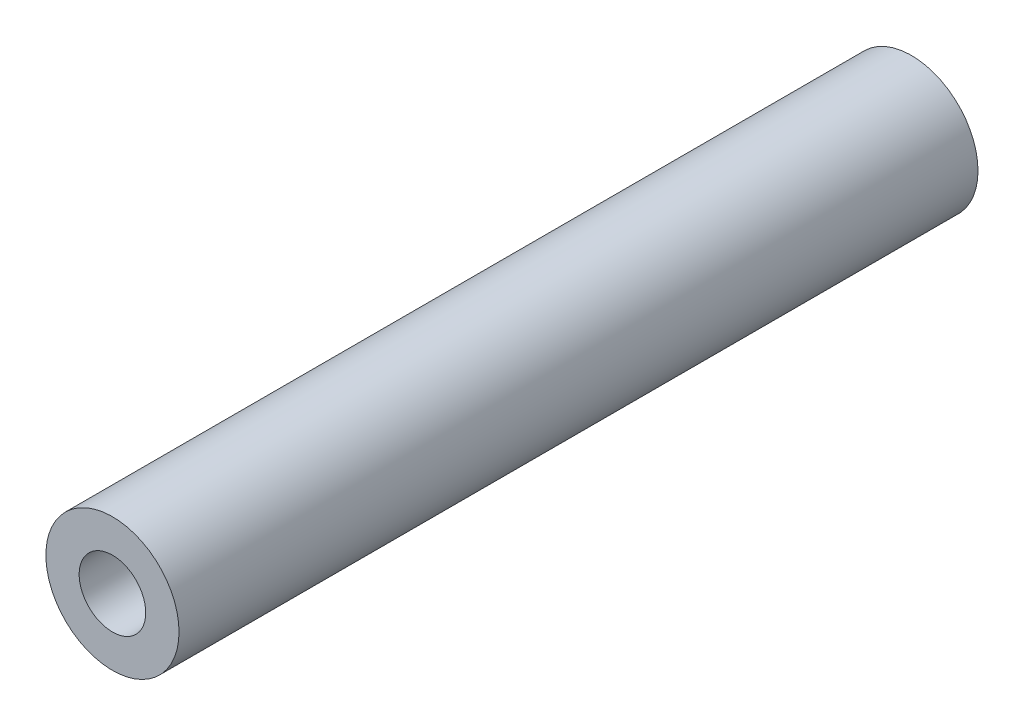
ISO-10303-21;
HEADER;
FILE_DESCRIPTION(('STEP AP214'),'2;1');
FILE_NAME('part.step','',(''),(''),'','','');
FILE_SCHEMA(('AUTOMOTIVE_DESIGN { 1 0 10303 214 1 1 1 1 }'));
ENDSEC;
DATA;
#1=APPLICATION_CONTEXT('core data for automotive mechanical design processes');
#2=APPLICATION_PROTOCOL_DEFINITION('international standard','automotive_design',2000,#1);
#3=PRODUCT_CONTEXT('',#1,'mechanical');
#4=PRODUCT('Part','Part','',(#3));
#5=PRODUCT_RELATED_PRODUCT_CATEGORY('part','',(#4));
#6=PRODUCT_DEFINITION_FORMATION('','',#4);
#7=PRODUCT_DEFINITION_CONTEXT('part definition',#1,'design');
#8=PRODUCT_DEFINITION('design','',#6,#7);
#9=PRODUCT_DEFINITION_SHAPE('','',#8);
#10=(LENGTH_UNIT() NAMED_UNIT(*) SI_UNIT(.MILLI.,.METRE.));
#11=(NAMED_UNIT(*) PLANE_ANGLE_UNIT() SI_UNIT($,.RADIAN.));
#12=(NAMED_UNIT(*) SI_UNIT($,.STERADIAN.) SOLID_ANGLE_UNIT());
#13=UNCERTAINTY_MEASURE_WITH_UNIT(LENGTH_MEASURE(1.E-05),#10,'distance_accuracy_value','');
#14=(GEOMETRIC_REPRESENTATION_CONTEXT(3) GLOBAL_UNCERTAINTY_ASSIGNED_CONTEXT((#13)) GLOBAL_UNIT_ASSIGNED_CONTEXT((#10,
#11,#12)) REPRESENTATION_CONTEXT('',''));
#15=CARTESIAN_POINT('',(0.,0.,0.));
#16=DIRECTION('',(0.,0.,1.));
#17=DIRECTION('',(1.,0.,0.));
#18=AXIS2_PLACEMENT_3D('',#15,#16,#17);
#19=CARTESIAN_POINT('',(0.,0.,60.));
#20=DIRECTION('',(0.,0.,1.));
#21=DIRECTION('',(1.,0.,0.));
#22=AXIS2_PLACEMENT_3D('',#19,#20,#21);
#23=PLANE('',#22);
#24=CARTESIAN_POINT('',(0.,0.,60.));
#25=DIRECTION('',(0.,0.,1.));
#26=DIRECTION('',(1.,0.,0.));
#27=AXIS2_PLACEMENT_3D('',#24,#25,#26);
#28=CIRCLE('',#27,5.);
#29=CARTESIAN_POINT('',(5.,0.,60.));
#30=VERTEX_POINT('',#29);
#31=EDGE_CURVE('E10',#30,#30,#28,.T.);
#32=ORIENTED_EDGE('',*,*,#31,.T.);
#33=EDGE_LOOP('',(#32));
#34=FACE_BOUND('',#33,.T.);
#35=CARTESIAN_POINT('',(0.,0.,60.));
#36=DIRECTION('',(0.,0.,1.));
#37=DIRECTION('',(1.,0.,0.));
#38=AXIS2_PLACEMENT_3D('',#35,#36,#37);
#39=CIRCLE('',#38,2.5);
#40=CARTESIAN_POINT('',(2.5,0.,60.));
#41=VERTEX_POINT('',#40);
#42=EDGE_CURVE('E48',#41,#41,#39,.T.);
#43=ORIENTED_EDGE('',*,*,#42,.F.);
#44=EDGE_LOOP('',(#43));
#45=FACE_BOUND('',#44,.T.);
#46=ADVANCED_FACE('F37',(#34,#45),#23,.T.);
#47=CARTESIAN_POINT('',(0.,0.,0.));
#48=DIRECTION('',(0.,0.,1.));
#49=DIRECTION('',(1.,0.,0.));
#50=AXIS2_PLACEMENT_3D('',#47,#48,#49);
#51=PLANE('',#50);
#52=CARTESIAN_POINT('',(0.,0.,0.));
#53=DIRECTION('',(0.,0.,1.));
#54=DIRECTION('',(1.,0.,0.));
#55=AXIS2_PLACEMENT_3D('',#52,#53,#54);
#56=CIRCLE('',#55,5.);
#57=CARTESIAN_POINT('',(5.,0.,0.));
#58=VERTEX_POINT('',#57);
#59=EDGE_CURVE('E41',#58,#58,#56,.T.);
#60=ORIENTED_EDGE('',*,*,#59,.F.);
#61=EDGE_LOOP('',(#60));
#62=FACE_BOUND('',#61,.T.);
#63=CARTESIAN_POINT('',(0.,0.,0.));
#64=DIRECTION('',(0.,0.,1.));
#65=DIRECTION('',(1.,0.,0.));
#66=AXIS2_PLACEMENT_3D('',#63,#64,#65);
#67=CIRCLE('',#66,2.5);
#68=CARTESIAN_POINT('',(2.5,0.,0.));
#69=VERTEX_POINT('',#68);
#70=EDGE_CURVE('E50',#69,#69,#67,.T.);
#71=ORIENTED_EDGE('',*,*,#70,.T.);
#72=EDGE_LOOP('',(#71));
#73=FACE_BOUND('',#72,.T.);
#74=ADVANCED_FACE('F60',(#62,#73),#51,.F.);
#75=CARTESIAN_POINT('',(0.,0.,60.));
#76=DIRECTION('',(0.,0.,-1.));
#77=DIRECTION('',(-1.,0.,0.));
#78=AXIS2_PLACEMENT_3D('',#75,#76,#77);
#79=CYLINDRICAL_SURFACE('',#78,5.);
#80=ORIENTED_EDGE('',*,*,#31,.F.);
#81=EDGE_LOOP('',(#80));
#82=FACE_BOUND('',#81,.T.);
#83=ORIENTED_EDGE('',*,*,#59,.T.);
#84=EDGE_LOOP('',(#83));
#85=FACE_BOUND('',#84,.T.);
#86=ADVANCED_FACE('F39',(#82,#85),#79,.T.);
#87=CARTESIAN_POINT('',(0.,0.,60.));
#88=DIRECTION('',(0.,0.,-1.));
#89=DIRECTION('',(-1.,0.,0.));
#90=AXIS2_PLACEMENT_3D('',#87,#88,#89);
#91=CYLINDRICAL_SURFACE('',#90,2.5);
#92=ORIENTED_EDGE('',*,*,#42,.T.);
#93=EDGE_LOOP('',(#92));
#94=FACE_BOUND('',#93,.T.);
#95=ORIENTED_EDGE('',*,*,#70,.F.);
#96=EDGE_LOOP('',(#95));
#97=FACE_BOUND('',#96,.T.);
#98=ADVANCED_FACE('F56',(#94,#97),#91,.F.);
#99=CLOSED_SHELL('',(#46,#74,#86,#98));
#100=MANIFOLD_SOLID_BREP('B2',#99);
#101=ADVANCED_BREP_SHAPE_REPRESENTATION('',(#18,#100),#14);
#102=SHAPE_DEFINITION_REPRESENTATION(#9,#101);
ENDSEC;
END-ISO-10303-21;
